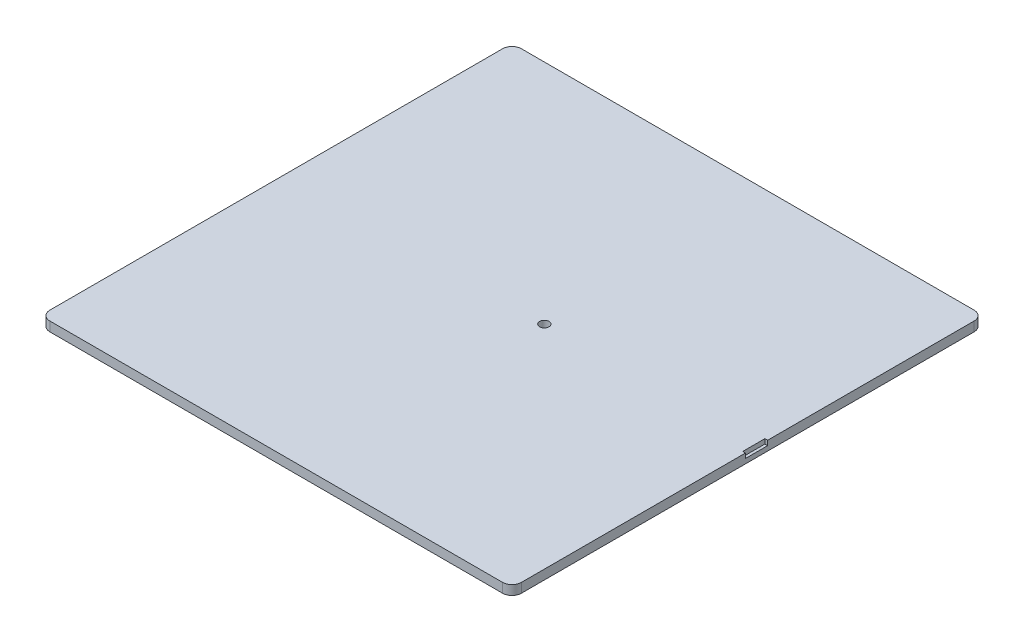
ISO-10303-21;
HEADER;
FILE_DESCRIPTION(('STEP AP214'),'2;1');
FILE_NAME('part.step','',(''),(''),'','','');
FILE_SCHEMA(('AUTOMOTIVE_DESIGN { 1 0 10303 214 1 1 1 1 }'));
ENDSEC;
DATA;
#1=APPLICATION_CONTEXT('core data for automotive mechanical design processes');
#2=APPLICATION_PROTOCOL_DEFINITION('international standard','automotive_design',2000,#1);
#3=PRODUCT_CONTEXT('',#1,'mechanical');
#4=PRODUCT('Part','Part','',(#3));
#5=PRODUCT_RELATED_PRODUCT_CATEGORY('part','',(#4));
#6=PRODUCT_DEFINITION_FORMATION('','',#4);
#7=PRODUCT_DEFINITION_CONTEXT('part definition',#1,'design');
#8=PRODUCT_DEFINITION('design','',#6,#7);
#9=PRODUCT_DEFINITION_SHAPE('','',#8);
#10=(LENGTH_UNIT() NAMED_UNIT(*) SI_UNIT(.MILLI.,.METRE.));
#11=(NAMED_UNIT(*) PLANE_ANGLE_UNIT() SI_UNIT($,.RADIAN.));
#12=(NAMED_UNIT(*) SI_UNIT($,.STERADIAN.) SOLID_ANGLE_UNIT());
#13=UNCERTAINTY_MEASURE_WITH_UNIT(LENGTH_MEASURE(1.E-05),#10,'distance_accuracy_value','');
#14=(GEOMETRIC_REPRESENTATION_CONTEXT(3) GLOBAL_UNCERTAINTY_ASSIGNED_CONTEXT((#13)) GLOBAL_UNIT_ASSIGNED_CONTEXT((#10,
#11,#12)) REPRESENTATION_CONTEXT('',''));
#15=CARTESIAN_POINT('',(0.,0.,0.));
#16=DIRECTION('',(0.,0.,1.));
#17=DIRECTION('',(1.,0.,0.));
#18=AXIS2_PLACEMENT_3D('',#15,#16,#17);
#19=CARTESIAN_POINT('',(-240.,5.,240.));
#20=DIRECTION('',(0.,-1.,0.));
#21=DIRECTION('',(0.,0.,-1.));
#22=AXIS2_PLACEMENT_3D('',#19,#20,#21);
#23=PLANE('',#22);
#24=DIRECTION('',(0.,0.,1.));
#25=VECTOR('',#24,1.);
#26=CARTESIAN_POINT('',(247.1,5.,-21.0418773028128));
#27=LINE('',#26,#25);
#28=CARTESIAN_POINT('',(247.1,5.,-21.0418773028128));
#29=VERTEX_POINT('',#28);
#30=CARTESIAN_POINT('',(247.1,5.,2.45812269718721));
#31=VERTEX_POINT('',#30);
#32=EDGE_CURVE('E221',#29,#31,#27,.T.);
#33=ORIENTED_EDGE('',*,*,#32,.F.);
#34=DIRECTION('',(1.,0.,0.));
#35=VECTOR('',#34,1.);
#36=CARTESIAN_POINT('',(247.1,5.,-21.0418773028128));
#37=LINE('',#36,#35);
#38=CARTESIAN_POINT('',(250.,5.,-21.0418773028128));
#39=VERTEX_POINT('',#38);
#40=EDGE_CURVE('E205',#29,#39,#37,.T.);
#41=ORIENTED_EDGE('',*,*,#40,.T.);
#42=DIRECTION('',(0.,0.,-1.));
#43=VECTOR('',#42,1.);
#44=CARTESIAN_POINT('',(250.,5.,240.));
#45=LINE('',#44,#43);
#46=CARTESIAN_POINT('',(250.,5.,-240.));
#47=VERTEX_POINT('',#46);
#48=EDGE_CURVE('E196',#39,#47,#45,.T.);
#49=ORIENTED_EDGE('',*,*,#48,.T.);
#50=CARTESIAN_POINT('',(240.,5.,-240.));
#51=DIRECTION('',(0.,1.,0.));
#52=DIRECTION('',(0.,0.,-1.));
#53=AXIS2_PLACEMENT_3D('',#50,#51,#52);
#54=CIRCLE('',#53,10.);
#55=CARTESIAN_POINT('',(240.,5.,-250.));
#56=VERTEX_POINT('',#55);
#57=EDGE_CURVE('E128',#47,#56,#54,.T.);
#58=ORIENTED_EDGE('',*,*,#57,.T.);
#59=DIRECTION('',(-1.,0.,0.));
#60=VECTOR('',#59,1.);
#61=CARTESIAN_POINT('',(-240.,5.,-250.));
#62=LINE('',#61,#60);
#63=CARTESIAN_POINT('',(-240.,5.,-250.));
#64=VERTEX_POINT('',#63);
#65=EDGE_CURVE('E120',#56,#64,#62,.T.);
#66=ORIENTED_EDGE('',*,*,#65,.T.);
#67=CARTESIAN_POINT('',(-240.,5.,-240.));
#68=DIRECTION('',(0.,1.,0.));
#69=DIRECTION('',(0.,0.,-1.));
#70=AXIS2_PLACEMENT_3D('',#67,#68,#69);
#71=CIRCLE('',#70,10.);
#72=CARTESIAN_POINT('',(-250.,5.,-240.));
#73=VERTEX_POINT('',#72);
#74=EDGE_CURVE('E125',#64,#73,#71,.T.);
#75=ORIENTED_EDGE('',*,*,#74,.T.);
#76=DIRECTION('',(0.,0.,1.));
#77=VECTOR('',#76,1.);
#78=CARTESIAN_POINT('',(-250.,5.,240.));
#79=LINE('',#78,#77);
#80=CARTESIAN_POINT('',(-250.,5.,240.));
#81=VERTEX_POINT('',#80);
#82=EDGE_CURVE('E63',#73,#81,#79,.T.);
#83=ORIENTED_EDGE('',*,*,#82,.T.);
#84=CARTESIAN_POINT('',(-240.,5.,240.));
#85=DIRECTION('',(0.,1.,0.));
#86=DIRECTION('',(0.,0.,-1.));
#87=AXIS2_PLACEMENT_3D('',#84,#85,#86);
#88=CIRCLE('',#87,10.);
#89=CARTESIAN_POINT('',(-240.,5.,250.));
#90=VERTEX_POINT('',#89);
#91=EDGE_CURVE('E165',#81,#90,#88,.T.);
#92=ORIENTED_EDGE('',*,*,#91,.T.);
#93=DIRECTION('',(1.,0.,0.));
#94=VECTOR('',#93,1.);
#95=CARTESIAN_POINT('',(-240.,5.,250.));
#96=LINE('',#95,#94);
#97=CARTESIAN_POINT('',(240.,5.,250.));
#98=VERTEX_POINT('',#97);
#99=EDGE_CURVE('E104',#90,#98,#96,.T.);
#100=ORIENTED_EDGE('',*,*,#99,.T.);
#101=CARTESIAN_POINT('',(240.,5.,240.));
#102=DIRECTION('',(0.,1.,0.));
#103=DIRECTION('',(0.,0.,1.));
#104=AXIS2_PLACEMENT_3D('',#101,#102,#103);
#105=CIRCLE('',#104,10.);
#106=CARTESIAN_POINT('',(250.,5.,240.));
#107=VERTEX_POINT('',#106);
#108=EDGE_CURVE('E180',#98,#107,#105,.T.);
#109=ORIENTED_EDGE('',*,*,#108,.T.);
#110=CARTESIAN_POINT('',(250.,5.,2.45812269718726));
#111=VERTEX_POINT('',#110);
#112=EDGE_CURVE('E194',#107,#111,#45,.T.);
#113=ORIENTED_EDGE('',*,*,#112,.T.);
#114=DIRECTION('',(1.,0.,0.));
#115=VECTOR('',#114,1.);
#116=CARTESIAN_POINT('',(247.1,5.,2.45812269718721));
#117=LINE('',#116,#115);
#118=EDGE_CURVE('E54',#31,#111,#117,.T.);
#119=ORIENTED_EDGE('',*,*,#118,.F.);
#120=EDGE_LOOP('',(#33,#41,#49,#58,#66,#75,#83,#92,#100,#109,#113,#119));
#121=FACE_BOUND('',#120,.T.);
#122=CARTESIAN_POINT('',(25.0332566960794,5.,-9.29187730281292));
#123=DIRECTION('',(0.,1.,0.));
#124=DIRECTION('',(0.,0.,1.));
#125=AXIS2_PLACEMENT_3D('',#122,#123,#124);
#126=CIRCLE('',#125,5.00000000000003);
#127=CARTESIAN_POINT('',(25.0332566960794,5.,-4.29187730281289));
#128=VERTEX_POINT('',#127);
#129=EDGE_CURVE('E153',#128,#128,#126,.T.);
#130=ORIENTED_EDGE('',*,*,#129,.F.);
#131=EDGE_LOOP('',(#130));
#132=FACE_BOUND('',#131,.T.);
#133=ADVANCED_FACE('F39',(#121,#132),#23,.F.);
#134=CARTESIAN_POINT('',(-240.,-5.,240.));
#135=DIRECTION('',(0.,-1.,0.));
#136=DIRECTION('',(0.,0.,-1.));
#137=AXIS2_PLACEMENT_3D('',#134,#135,#136);
#138=PLANE('',#137);
#139=CARTESIAN_POINT('',(-240.,-5.,240.));
#140=DIRECTION('',(0.,1.,0.));
#141=DIRECTION('',(0.,0.,-1.));
#142=AXIS2_PLACEMENT_3D('',#139,#140,#141);
#143=CIRCLE('',#142,10.);
#144=CARTESIAN_POINT('',(-250.,-5.,240.));
#145=VERTEX_POINT('',#144);
#146=CARTESIAN_POINT('',(-240.,-5.,250.));
#147=VERTEX_POINT('',#146);
#148=EDGE_CURVE('E149',#145,#147,#143,.T.);
#149=ORIENTED_EDGE('',*,*,#148,.F.);
#150=DIRECTION('',(0.,0.,1.));
#151=VECTOR('',#150,1.);
#152=CARTESIAN_POINT('',(-250.,-5.,240.));
#153=LINE('',#152,#151);
#154=CARTESIAN_POINT('',(-250.,-5.,-240.));
#155=VERTEX_POINT('',#154);
#156=EDGE_CURVE('E96',#155,#145,#153,.T.);
#157=ORIENTED_EDGE('',*,*,#156,.F.);
#158=CARTESIAN_POINT('',(-240.,-5.,-240.));
#159=DIRECTION('',(0.,1.,0.));
#160=DIRECTION('',(0.,0.,-1.));
#161=AXIS2_PLACEMENT_3D('',#158,#159,#160);
#162=CIRCLE('',#161,10.);
#163=CARTESIAN_POINT('',(-240.,-5.,-250.));
#164=VERTEX_POINT('',#163);
#165=EDGE_CURVE('E162',#164,#155,#162,.T.);
#166=ORIENTED_EDGE('',*,*,#165,.F.);
#167=DIRECTION('',(-1.,0.,0.));
#168=VECTOR('',#167,1.);
#169=CARTESIAN_POINT('',(-240.,-5.,-250.));
#170=LINE('',#169,#168);
#171=CARTESIAN_POINT('',(240.,-5.,-250.));
#172=VERTEX_POINT('',#171);
#173=EDGE_CURVE('E137',#172,#164,#170,.T.);
#174=ORIENTED_EDGE('',*,*,#173,.F.);
#175=CARTESIAN_POINT('',(240.,-5.,-240.));
#176=DIRECTION('',(0.,1.,0.));
#177=DIRECTION('',(0.,0.,-1.));
#178=AXIS2_PLACEMENT_3D('',#175,#176,#177);
#179=CIRCLE('',#178,10.);
#180=CARTESIAN_POINT('',(250.,-5.,-240.));
#181=VERTEX_POINT('',#180);
#182=EDGE_CURVE('E159',#181,#172,#179,.T.);
#183=ORIENTED_EDGE('',*,*,#182,.F.);
#184=DIRECTION('',(0.,0.,-1.));
#185=VECTOR('',#184,1.);
#186=CARTESIAN_POINT('',(250.,-5.,240.));
#187=LINE('',#186,#185);
#188=CARTESIAN_POINT('',(250.,-5.,240.));
#189=VERTEX_POINT('',#188);
#190=EDGE_CURVE('E157',#189,#181,#187,.T.);
#191=ORIENTED_EDGE('',*,*,#190,.F.);
#192=CARTESIAN_POINT('',(240.,-5.,240.));
#193=DIRECTION('',(0.,1.,0.));
#194=DIRECTION('',(0.,0.,1.));
#195=AXIS2_PLACEMENT_3D('',#192,#193,#194);
#196=CIRCLE('',#195,10.);
#197=CARTESIAN_POINT('',(240.,-5.,250.));
#198=VERTEX_POINT('',#197);
#199=EDGE_CURVE('E155',#198,#189,#196,.T.);
#200=ORIENTED_EDGE('',*,*,#199,.F.);
#201=DIRECTION('',(1.,0.,0.));
#202=VECTOR('',#201,1.);
#203=CARTESIAN_POINT('',(-240.,-5.,250.));
#204=LINE('',#203,#202);
#205=EDGE_CURVE('E152',#147,#198,#204,.T.);
#206=ORIENTED_EDGE('',*,*,#205,.F.);
#207=EDGE_LOOP('',(#149,#157,#166,#174,#183,#191,#200,#206));
#208=FACE_BOUND('',#207,.T.);
#209=CARTESIAN_POINT('',(25.0332566960794,-5.,-9.29187730281292));
#210=DIRECTION('',(0.,1.,0.));
#211=DIRECTION('',(0.,0.,1.));
#212=AXIS2_PLACEMENT_3D('',#209,#210,#211);
#213=CIRCLE('',#212,5.00000000000003);
#214=CARTESIAN_POINT('',(25.0332566960794,-5.,-4.29187730281289));
#215=VERTEX_POINT('',#214);
#216=EDGE_CURVE('E202',#215,#215,#213,.T.);
#217=ORIENTED_EDGE('',*,*,#216,.T.);
#218=EDGE_LOOP('',(#217));
#219=FACE_BOUND('',#218,.T.);
#220=ADVANCED_FACE('F184',(#208,#219),#138,.T.);
#221=CARTESIAN_POINT('',(-240.,5.,240.));
#222=DIRECTION('',(0.,-1.,0.));
#223=DIRECTION('',(0.,0.,-1.));
#224=AXIS2_PLACEMENT_3D('',#221,#222,#223);
#225=CYLINDRICAL_SURFACE('',#224,10.);
#226=ORIENTED_EDGE('',*,*,#148,.T.);
#227=DIRECTION('',(0.,-1.,0.));
#228=VECTOR('',#227,1.);
#229=CARTESIAN_POINT('',(-240.,5.,250.));
#230=LINE('',#229,#228);
#231=EDGE_CURVE('E11',#90,#147,#230,.T.);
#232=ORIENTED_EDGE('',*,*,#231,.F.);
#233=ORIENTED_EDGE('',*,*,#91,.F.);
#234=DIRECTION('',(0.,-1.,0.));
#235=VECTOR('',#234,1.);
#236=CARTESIAN_POINT('',(-250.,5.,240.));
#237=LINE('',#236,#235);
#238=EDGE_CURVE('E145',#81,#145,#237,.T.);
#239=ORIENTED_EDGE('',*,*,#238,.T.);
#240=EDGE_LOOP('',(#226,#232,#233,#239));
#241=FACE_BOUND('',#240,.T.);
#242=ADVANCED_FACE('F41',(#241),#225,.T.);
#243=CARTESIAN_POINT('',(-240.,5.,250.));
#244=DIRECTION('',(0.,0.,-1.));
#245=DIRECTION('',(-1.,0.,0.));
#246=AXIS2_PLACEMENT_3D('',#243,#244,#245);
#247=PLANE('',#246);
#248=ORIENTED_EDGE('',*,*,#205,.T.);
#249=DIRECTION('',(0.,-1.,0.));
#250=VECTOR('',#249,1.);
#251=CARTESIAN_POINT('',(240.,5.,250.));
#252=LINE('',#251,#250);
#253=EDGE_CURVE('E47',#98,#198,#252,.T.);
#254=ORIENTED_EDGE('',*,*,#253,.F.);
#255=ORIENTED_EDGE('',*,*,#99,.F.);
#256=ORIENTED_EDGE('',*,*,#231,.T.);
#257=EDGE_LOOP('',(#248,#254,#255,#256));
#258=FACE_BOUND('',#257,.T.);
#259=ADVANCED_FACE('F291',(#258),#247,.F.);
#260=CARTESIAN_POINT('',(240.,5.,240.));
#261=DIRECTION('',(0.,-1.,0.));
#262=DIRECTION('',(0.,0.,-1.));
#263=AXIS2_PLACEMENT_3D('',#260,#261,#262);
#264=CYLINDRICAL_SURFACE('',#263,10.);
#265=ORIENTED_EDGE('',*,*,#199,.T.);
#266=DIRECTION('',(0.,-1.,0.));
#267=VECTOR('',#266,1.);
#268=CARTESIAN_POINT('',(250.,5.,240.));
#269=LINE('',#268,#267);
#270=EDGE_CURVE('E172',#107,#189,#269,.T.);
#271=ORIENTED_EDGE('',*,*,#270,.F.);
#272=ORIENTED_EDGE('',*,*,#108,.F.);
#273=ORIENTED_EDGE('',*,*,#253,.T.);
#274=EDGE_LOOP('',(#265,#271,#272,#273));
#275=FACE_BOUND('',#274,.T.);
#276=ADVANCED_FACE('F178',(#275),#264,.T.);
#277=CARTESIAN_POINT('',(250.,5.,240.));
#278=DIRECTION('',(-1.,0.,0.));
#279=DIRECTION('',(0.,0.,1.));
#280=AXIS2_PLACEMENT_3D('',#277,#278,#279);
#281=PLANE('',#280);
#282=ORIENTED_EDGE('',*,*,#48,.F.);
#283=DIRECTION('',(0.,1.,0.));
#284=VECTOR('',#283,1.);
#285=CARTESIAN_POINT('',(250.,0.0110076761118405,-21.0418773028128));
#286=LINE('',#285,#284);
#287=CARTESIAN_POINT('',(250.,0.0110076761118405,-21.0418773028128));
#288=VERTEX_POINT('',#287);
#289=EDGE_CURVE('E218',#288,#39,#286,.T.);
#290=ORIENTED_EDGE('',*,*,#289,.F.);
#291=DIRECTION('',(0.,0.,-1.));
#292=VECTOR('',#291,1.);
#293=CARTESIAN_POINT('',(250.,0.0110076761118405,2.45812269718718));
#294=LINE('',#293,#292);
#295=CARTESIAN_POINT('',(250.,0.0110076761118405,2.45812269718718));
#296=VERTEX_POINT('',#295);
#297=EDGE_CURVE('E222',#296,#288,#294,.T.);
#298=ORIENTED_EDGE('',*,*,#297,.F.);
#299=DIRECTION('',(0.,-1.,0.));
#300=VECTOR('',#299,1.);
#301=CARTESIAN_POINT('',(250.,5.,2.45812269718721));
#302=LINE('',#301,#300);
#303=EDGE_CURVE('E225',#111,#296,#302,.T.);
#304=ORIENTED_EDGE('',*,*,#303,.F.);
#305=ORIENTED_EDGE('',*,*,#112,.F.);
#306=ORIENTED_EDGE('',*,*,#270,.T.);
#307=ORIENTED_EDGE('',*,*,#190,.T.);
#308=DIRECTION('',(0.,-1.,0.));
#309=VECTOR('',#308,1.);
#310=CARTESIAN_POINT('',(250.,5.,-240.));
#311=LINE('',#310,#309);
#312=EDGE_CURVE('E169',#47,#181,#311,.T.);
#313=ORIENTED_EDGE('',*,*,#312,.F.);
#314=EDGE_LOOP('',(#282,#290,#298,#304,#305,#306,#307,#313));
#315=FACE_BOUND('',#314,.T.);
#316=ADVANCED_FACE('F190',(#315),#281,.F.);
#317=CARTESIAN_POINT('',(240.,5.,-240.));
#318=DIRECTION('',(0.,-1.,0.));
#319=DIRECTION('',(0.,0.,-1.));
#320=AXIS2_PLACEMENT_3D('',#317,#318,#319);
#321=CYLINDRICAL_SURFACE('',#320,10.);
#322=ORIENTED_EDGE('',*,*,#182,.T.);
#323=DIRECTION('',(0.,-1.,0.));
#324=VECTOR('',#323,1.);
#325=CARTESIAN_POINT('',(240.,5.,-250.));
#326=LINE('',#325,#324);
#327=EDGE_CURVE('E140',#56,#172,#326,.T.);
#328=ORIENTED_EDGE('',*,*,#327,.F.);
#329=ORIENTED_EDGE('',*,*,#57,.F.);
#330=ORIENTED_EDGE('',*,*,#312,.T.);
#331=EDGE_LOOP('',(#322,#328,#329,#330));
#332=FACE_BOUND('',#331,.T.);
#333=ADVANCED_FACE('F193',(#332),#321,.T.);
#334=CARTESIAN_POINT('',(-240.,5.,-250.));
#335=DIRECTION('',(0.,0.,1.));
#336=DIRECTION('',(1.,0.,0.));
#337=AXIS2_PLACEMENT_3D('',#334,#335,#336);
#338=PLANE('',#337);
#339=ORIENTED_EDGE('',*,*,#173,.T.);
#340=DIRECTION('',(0.,-1.,0.));
#341=VECTOR('',#340,1.);
#342=CARTESIAN_POINT('',(-240.,5.,-250.));
#343=LINE('',#342,#341);
#344=EDGE_CURVE('E134',#64,#164,#343,.T.);
#345=ORIENTED_EDGE('',*,*,#344,.F.);
#346=ORIENTED_EDGE('',*,*,#65,.F.);
#347=ORIENTED_EDGE('',*,*,#327,.T.);
#348=EDGE_LOOP('',(#339,#345,#346,#347));
#349=FACE_BOUND('',#348,.T.);
#350=ADVANCED_FACE('F135',(#349),#338,.F.);
#351=CARTESIAN_POINT('',(-240.,5.,-240.));
#352=DIRECTION('',(0.,-1.,0.));
#353=DIRECTION('',(0.,0.,-1.));
#354=AXIS2_PLACEMENT_3D('',#351,#352,#353);
#355=CYLINDRICAL_SURFACE('',#354,10.);
#356=ORIENTED_EDGE('',*,*,#165,.T.);
#357=DIRECTION('',(0.,-1.,0.));
#358=VECTOR('',#357,1.);
#359=CARTESIAN_POINT('',(-250.,5.,-240.));
#360=LINE('',#359,#358);
#361=EDGE_CURVE('E141',#73,#155,#360,.T.);
#362=ORIENTED_EDGE('',*,*,#361,.F.);
#363=ORIENTED_EDGE('',*,*,#74,.F.);
#364=ORIENTED_EDGE('',*,*,#344,.T.);
#365=EDGE_LOOP('',(#356,#362,#363,#364));
#366=FACE_BOUND('',#365,.T.);
#367=ADVANCED_FACE('F143',(#366),#355,.T.);
#368=CARTESIAN_POINT('',(-250.,5.,240.));
#369=DIRECTION('',(1.,0.,0.));
#370=DIRECTION('',(0.,0.,-1.));
#371=AXIS2_PLACEMENT_3D('',#368,#369,#370);
#372=PLANE('',#371);
#373=ORIENTED_EDGE('',*,*,#156,.T.);
#374=ORIENTED_EDGE('',*,*,#238,.F.);
#375=ORIENTED_EDGE('',*,*,#82,.F.);
#376=ORIENTED_EDGE('',*,*,#361,.T.);
#377=EDGE_LOOP('',(#373,#374,#375,#376));
#378=FACE_BOUND('',#377,.T.);
#379=ADVANCED_FACE('F269',(#378),#372,.F.);
#380=CARTESIAN_POINT('',(25.0332566960794,5.,-9.29187730281292));
#381=DIRECTION('',(0.,-1.,0.));
#382=DIRECTION('',(0.,0.,-1.));
#383=AXIS2_PLACEMENT_3D('',#380,#381,#382);
#384=CYLINDRICAL_SURFACE('',#383,5.00000000000003);
#385=ORIENTED_EDGE('',*,*,#129,.T.);
#386=EDGE_LOOP('',(#385));
#387=FACE_BOUND('',#386,.T.);
#388=ORIENTED_EDGE('',*,*,#216,.F.);
#389=EDGE_LOOP('',(#388));
#390=FACE_BOUND('',#389,.T.);
#391=ADVANCED_FACE('F261',(#387,#390),#384,.F.);
#392=CARTESIAN_POINT('',(247.1,0.0110076761118405,-21.0418773028128));
#393=DIRECTION('',(0.,0.,-1.));
#394=DIRECTION('',(0.,1.,0.));
#395=AXIS2_PLACEMENT_3D('',#392,#393,#394);
#396=PLANE('',#395);
#397=ORIENTED_EDGE('',*,*,#289,.T.);
#398=ORIENTED_EDGE('',*,*,#40,.F.);
#399=DIRECTION('',(0.,1.,0.));
#400=VECTOR('',#399,1.);
#401=CARTESIAN_POINT('',(247.1,0.0110076761118405,-21.0418773028128));
#402=LINE('',#401,#400);
#403=CARTESIAN_POINT('',(247.1,0.0110076761118405,-21.0418773028128));
#404=VERTEX_POINT('',#403);
#405=EDGE_CURVE('E210',#404,#29,#402,.T.);
#406=ORIENTED_EDGE('',*,*,#405,.F.);
#407=DIRECTION('',(1.,0.,0.));
#408=VECTOR('',#407,1.);
#409=CARTESIAN_POINT('',(247.1,0.0110076761118405,-21.0418773028128));
#410=LINE('',#409,#408);
#411=EDGE_CURVE('E213',#404,#288,#410,.T.);
#412=ORIENTED_EDGE('',*,*,#411,.T.);
#413=EDGE_LOOP('',(#397,#398,#406,#412));
#414=FACE_BOUND('',#413,.T.);
#415=ADVANCED_FACE('F259',(#414),#396,.F.);
#416=CARTESIAN_POINT('',(247.1,0.0110076761118405,2.45812269718718));
#417=DIRECTION('',(0.,-1.,0.));
#418=DIRECTION('',(0.,0.,-1.));
#419=AXIS2_PLACEMENT_3D('',#416,#417,#418);
#420=PLANE('',#419);
#421=ORIENTED_EDGE('',*,*,#297,.T.);
#422=ORIENTED_EDGE('',*,*,#411,.F.);
#423=DIRECTION('',(0.,0.,-1.));
#424=VECTOR('',#423,1.);
#425=CARTESIAN_POINT('',(247.1,0.0110076761118405,2.45812269718718));
#426=LINE('',#425,#424);
#427=CARTESIAN_POINT('',(247.1,0.0110076761118405,2.45812269718718));
#428=VERTEX_POINT('',#427);
#429=EDGE_CURVE('E229',#428,#404,#426,.T.);
#430=ORIENTED_EDGE('',*,*,#429,.F.);
#431=DIRECTION('',(1.,0.,0.));
#432=VECTOR('',#431,1.);
#433=CARTESIAN_POINT('',(247.1,0.0110076761118405,2.45812269718718));
#434=LINE('',#433,#432);
#435=EDGE_CURVE('E209',#428,#296,#434,.T.);
#436=ORIENTED_EDGE('',*,*,#435,.T.);
#437=EDGE_LOOP('',(#421,#422,#430,#436));
#438=FACE_BOUND('',#437,.T.);
#439=ADVANCED_FACE('F257',(#438),#420,.F.);
#440=CARTESIAN_POINT('',(247.1,5.,2.45812269718721));
#441=DIRECTION('',(0.,0.,1.));
#442=DIRECTION('',(0.,-1.,0.));
#443=AXIS2_PLACEMENT_3D('',#440,#441,#442);
#444=PLANE('',#443);
#445=ORIENTED_EDGE('',*,*,#303,.T.);
#446=ORIENTED_EDGE('',*,*,#435,.F.);
#447=DIRECTION('',(0.,-1.,0.));
#448=VECTOR('',#447,1.);
#449=CARTESIAN_POINT('',(247.1,5.,2.45812269718721));
#450=LINE('',#449,#448);
#451=EDGE_CURVE('E232',#31,#428,#450,.T.);
#452=ORIENTED_EDGE('',*,*,#451,.F.);
#453=ORIENTED_EDGE('',*,*,#118,.T.);
#454=EDGE_LOOP('',(#445,#446,#452,#453));
#455=FACE_BOUND('',#454,.T.);
#456=ADVANCED_FACE('F246',(#455),#444,.F.);
#457=CARTESIAN_POINT('',(247.1,0.,0.));
#458=DIRECTION('',(1.,0.,0.));
#459=DIRECTION('',(0.,0.,-1.));
#460=AXIS2_PLACEMENT_3D('',#457,#458,#459);
#461=PLANE('',#460);
#462=ORIENTED_EDGE('',*,*,#32,.T.);
#463=ORIENTED_EDGE('',*,*,#451,.T.);
#464=ORIENTED_EDGE('',*,*,#429,.T.);
#465=ORIENTED_EDGE('',*,*,#405,.T.);
#466=EDGE_LOOP('',(#462,#463,#464,#465));
#467=FACE_BOUND('',#466,.T.);
#468=ADVANCED_FACE('F238',(#467),#461,.T.);
#469=CLOSED_SHELL('',(#133,#220,#242,#259,#276,#316,#333,#350,#367,#379,#391,#415,#439,#456,#468));
#470=MANIFOLD_SOLID_BREP('B2',#469);
#471=ADVANCED_BREP_SHAPE_REPRESENTATION('',(#18,#470),#14);
#472=SHAPE_DEFINITION_REPRESENTATION(#9,#471);
ENDSEC;
END-ISO-10303-21;
